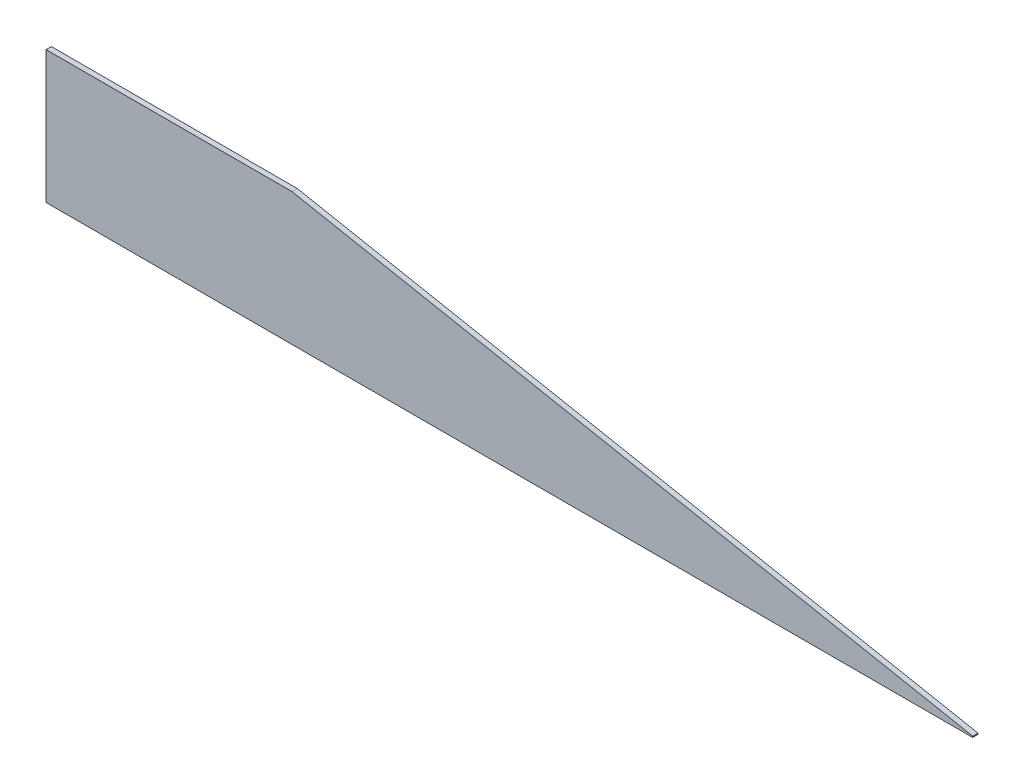
ISO-10303-21;
HEADER;
FILE_DESCRIPTION(('STEP AP214'),'2;1');
FILE_NAME('part.step','',(''),(''),'','','');
FILE_SCHEMA(('AUTOMOTIVE_DESIGN { 1 0 10303 214 1 1 1 1 }'));
ENDSEC;
DATA;
#1=APPLICATION_CONTEXT('core data for automotive mechanical design processes');
#2=APPLICATION_PROTOCOL_DEFINITION('international standard','automotive_design',2000,#1);
#3=PRODUCT_CONTEXT('',#1,'mechanical');
#4=PRODUCT('Part','Part','',(#3));
#5=PRODUCT_RELATED_PRODUCT_CATEGORY('part','',(#4));
#6=PRODUCT_DEFINITION_FORMATION('','',#4);
#7=PRODUCT_DEFINITION_CONTEXT('part definition',#1,'design');
#8=PRODUCT_DEFINITION('design','',#6,#7);
#9=PRODUCT_DEFINITION_SHAPE('','',#8);
#10=(LENGTH_UNIT() NAMED_UNIT(*) SI_UNIT(.MILLI.,.METRE.));
#11=(NAMED_UNIT(*) PLANE_ANGLE_UNIT() SI_UNIT($,.RADIAN.));
#12=(NAMED_UNIT(*) SI_UNIT($,.STERADIAN.) SOLID_ANGLE_UNIT());
#13=UNCERTAINTY_MEASURE_WITH_UNIT(LENGTH_MEASURE(1.E-05),#10,'distance_accuracy_value','');
#14=(GEOMETRIC_REPRESENTATION_CONTEXT(3) GLOBAL_UNCERTAINTY_ASSIGNED_CONTEXT((#13)) GLOBAL_UNIT_ASSIGNED_CONTEXT((#10,
#11,#12)) REPRESENTATION_CONTEXT('',''));
#15=CARTESIAN_POINT('',(0.,0.,0.));
#16=DIRECTION('',(0.,0.,1.));
#17=DIRECTION('',(1.,0.,0.));
#18=AXIS2_PLACEMENT_3D('',#15,#16,#17);
#19=CARTESIAN_POINT('',(778.,69.99,-0.01));
#20=DIRECTION('',(1.,0.,0.));
#21=DIRECTION('',(0.,1.,0.));
#22=AXIS2_PLACEMENT_3D('',#19,#20,#21);
#23=PLANE('',#22);
#24=DIRECTION('',(0.,-1.,0.));
#25=VECTOR('',#24,1.);
#26=CARTESIAN_POINT('',(778.,70.6445854996187,6.));
#27=LINE('',#26,#25);
#28=CARTESIAN_POINT('',(778.,71.2891709992374,6.));
#29=VERTEX_POINT('',#28);
#30=CARTESIAN_POINT('',(778.,70.,6.));
#31=VERTEX_POINT('',#30);
#32=EDGE_CURVE('E89',#29,#31,#27,.T.);
#33=ORIENTED_EDGE('',*,*,#32,.T.);
#34=DIRECTION('',(0.,0.,1.));
#35=VECTOR('',#34,1.);
#36=CARTESIAN_POINT('',(778.,70.,3.));
#37=LINE('',#36,#35);
#38=CARTESIAN_POINT('',(778.,70.,0.));
#39=VERTEX_POINT('',#38);
#40=EDGE_CURVE('E94',#39,#31,#37,.T.);
#41=ORIENTED_EDGE('',*,*,#40,.F.);
#42=DIRECTION('',(0.,-1.,0.));
#43=VECTOR('',#42,1.);
#44=CARTESIAN_POINT('',(778.,145.,0.));
#45=LINE('',#44,#43);
#46=CARTESIAN_POINT('',(778.,71.2891709992374,0.));
#47=VERTEX_POINT('',#46);
#48=EDGE_CURVE('E72',#47,#39,#45,.T.);
#49=ORIENTED_EDGE('',*,*,#48,.F.);
#50=DIRECTION('',(0.,0.,-1.));
#51=VECTOR('',#50,1.);
#52=CARTESIAN_POINT('',(778.,71.2891709992374,3.));
#53=LINE('',#52,#51);
#54=EDGE_CURVE('E69',#29,#47,#53,.T.);
#55=ORIENTED_EDGE('',*,*,#54,.F.);
#56=EDGE_LOOP('',(#33,#41,#49,#55));
#57=FACE_BOUND('',#56,.T.);
#58=ADVANCED_FACE('F17',(#57),#23,.T.);
#59=CARTESIAN_POINT('',(778.009819163138,71.2872778443907,-0.01));
#60=DIRECTION('',(0.189315484661945,0.981916313779954,0.));
#61=DIRECTION('',(-0.981916313779954,0.189315484661945,0.));
#62=AXIS2_PLACEMENT_3D('',#59,#60,#61);
#63=PLANE('',#62);
#64=DIRECTION('',(-0.981916313779954,0.189315484661945,0.));
#65=VECTOR('',#64,1.);
#66=CARTESIAN_POINT('',(778.,71.2891709992374,6.));
#67=LINE('',#66,#65);
#68=CARTESIAN_POINT('',(6.68650024937822,220.,6.));
#69=VERTEX_POINT('',#68);
#70=EDGE_CURVE('E79',#29,#69,#67,.T.);
#71=ORIENTED_EDGE('',*,*,#70,.F.);
#72=ORIENTED_EDGE('',*,*,#54,.T.);
#73=DIRECTION('',(0.981916313779954,-0.189315484661945,0.));
#74=VECTOR('',#73,1.);
#75=CARTESIAN_POINT('',(6.68650024937822,220.,0.));
#76=LINE('',#75,#74);
#77=CARTESIAN_POINT('',(6.68650024937828,220.,0.));
#78=VERTEX_POINT('',#77);
#79=EDGE_CURVE('E21',#78,#47,#76,.T.);
#80=ORIENTED_EDGE('',*,*,#79,.F.);
#81=DIRECTION('',(0.,0.,-1.));
#82=VECTOR('',#81,1.);
#83=CARTESIAN_POINT('',(6.68650024937833,220.,3.));
#84=LINE('',#83,#82);
#85=EDGE_CURVE('E67',#69,#78,#84,.T.);
#86=ORIENTED_EDGE('',*,*,#85,.F.);
#87=EDGE_LOOP('',(#71,#72,#80,#86));
#88=FACE_BOUND('',#87,.T.);
#89=ADVANCED_FACE('F65',(#88),#63,.T.);
#90=CARTESIAN_POINT('',(778.01,69.99,0.));
#91=DIRECTION('',(0.,0.,-1.));
#92=DIRECTION('',(-1.,0.,0.));
#93=AXIS2_PLACEMENT_3D('',#90,#91,#92);
#94=PLANE('',#93);
#95=DIRECTION('',(1.,0.,0.));
#96=VECTOR('',#95,1.);
#97=CARTESIAN_POINT('',(253.,70.,0.));
#98=LINE('',#97,#96);
#99=CARTESIAN_POINT('',(-272.,70.,0.));
#100=VERTEX_POINT('',#99);
#101=EDGE_CURVE('E91',#100,#39,#98,.T.);
#102=ORIENTED_EDGE('',*,*,#101,.F.);
#103=DIRECTION('',(0.,-1.,0.));
#104=VECTOR('',#103,1.);
#105=CARTESIAN_POINT('',(-272.,145.,0.));
#106=LINE('',#105,#104);
#107=CARTESIAN_POINT('',(-272.,220.,0.));
#108=VERTEX_POINT('',#107);
#109=EDGE_CURVE('E77',#108,#100,#106,.T.);
#110=ORIENTED_EDGE('',*,*,#109,.F.);
#111=DIRECTION('',(-1.,0.,0.));
#112=VECTOR('',#111,1.);
#113=CARTESIAN_POINT('',(-132.656749875311,220.,0.));
#114=LINE('',#113,#112);
#115=EDGE_CURVE('E74',#78,#108,#114,.T.);
#116=ORIENTED_EDGE('',*,*,#115,.F.);
#117=ORIENTED_EDGE('',*,*,#79,.T.);
#118=ORIENTED_EDGE('',*,*,#48,.T.);
#119=EDGE_LOOP('',(#102,#110,#116,#117,#118));
#120=FACE_BOUND('',#119,.T.);
#121=ADVANCED_FACE('F75',(#120),#94,.T.);
#122=CARTESIAN_POINT('',(-272.01,70.,-0.01));
#123=DIRECTION('',(0.,-1.,0.));
#124=DIRECTION('',(1.,0.,0.));
#125=AXIS2_PLACEMENT_3D('',#122,#123,#124);
#126=PLANE('',#125);
#127=DIRECTION('',(1.,0.,0.));
#128=VECTOR('',#127,1.);
#129=CARTESIAN_POINT('',(253.,70.,6.));
#130=LINE('',#129,#128);
#131=CARTESIAN_POINT('',(-272.,70.,6.));
#132=VERTEX_POINT('',#131);
#133=EDGE_CURVE('E92',#132,#31,#130,.T.);
#134=ORIENTED_EDGE('',*,*,#133,.F.);
#135=DIRECTION('',(0.,0.,1.));
#136=VECTOR('',#135,1.);
#137=CARTESIAN_POINT('',(-272.,70.,3.));
#138=LINE('',#137,#136);
#139=EDGE_CURVE('E83',#100,#132,#138,.T.);
#140=ORIENTED_EDGE('',*,*,#139,.F.);
#141=ORIENTED_EDGE('',*,*,#101,.T.);
#142=ORIENTED_EDGE('',*,*,#40,.T.);
#143=EDGE_LOOP('',(#134,#140,#141,#142));
#144=FACE_BOUND('',#143,.T.);
#145=ADVANCED_FACE('F102',(#144),#126,.T.);
#146=CARTESIAN_POINT('',(-272.01,69.99,6.));
#147=DIRECTION('',(0.,0.,1.));
#148=DIRECTION('',(1.,0.,0.));
#149=AXIS2_PLACEMENT_3D('',#146,#147,#148);
#150=PLANE('',#149);
#151=ORIENTED_EDGE('',*,*,#32,.F.);
#152=ORIENTED_EDGE('',*,*,#70,.T.);
#153=DIRECTION('',(1.,0.,0.));
#154=VECTOR('',#153,1.);
#155=CARTESIAN_POINT('',(-132.656749875311,220.,6.));
#156=LINE('',#155,#154);
#157=CARTESIAN_POINT('',(-272.,220.,6.));
#158=VERTEX_POINT('',#157);
#159=EDGE_CURVE('E36',#158,#69,#156,.T.);
#160=ORIENTED_EDGE('',*,*,#159,.F.);
#161=DIRECTION('',(0.,1.,0.));
#162=VECTOR('',#161,1.);
#163=CARTESIAN_POINT('',(-272.,145.,6.));
#164=LINE('',#163,#162);
#165=EDGE_CURVE('E27',#132,#158,#164,.T.);
#166=ORIENTED_EDGE('',*,*,#165,.F.);
#167=ORIENTED_EDGE('',*,*,#133,.T.);
#168=EDGE_LOOP('',(#151,#152,#160,#166,#167));
#169=FACE_BOUND('',#168,.T.);
#170=ADVANCED_FACE('F106',(#169),#150,.T.);
#171=CARTESIAN_POINT('',(6.69650024937834,220.,-0.01));
#172=DIRECTION('',(0.,1.,0.));
#173=DIRECTION('',(-1.,0.,0.));
#174=AXIS2_PLACEMENT_3D('',#171,#172,#173);
#175=PLANE('',#174);
#176=ORIENTED_EDGE('',*,*,#159,.T.);
#177=ORIENTED_EDGE('',*,*,#85,.T.);
#178=ORIENTED_EDGE('',*,*,#115,.T.);
#179=DIRECTION('',(0.,0.,-1.));
#180=VECTOR('',#179,1.);
#181=CARTESIAN_POINT('',(-272.,220.,3.));
#182=LINE('',#181,#180);
#183=EDGE_CURVE('E11',#158,#108,#182,.T.);
#184=ORIENTED_EDGE('',*,*,#183,.F.);
#185=EDGE_LOOP('',(#176,#177,#178,#184));
#186=FACE_BOUND('',#185,.T.);
#187=ADVANCED_FACE('F81',(#186),#175,.T.);
#188=CARTESIAN_POINT('',(-272.,220.01,-0.01));
#189=DIRECTION('',(-1.,0.,0.));
#190=DIRECTION('',(0.,-1.,0.));
#191=AXIS2_PLACEMENT_3D('',#188,#189,#190);
#192=PLANE('',#191);
#193=ORIENTED_EDGE('',*,*,#165,.T.);
#194=ORIENTED_EDGE('',*,*,#183,.T.);
#195=ORIENTED_EDGE('',*,*,#109,.T.);
#196=ORIENTED_EDGE('',*,*,#139,.T.);
#197=EDGE_LOOP('',(#193,#194,#195,#196));
#198=FACE_BOUND('',#197,.T.);
#199=ADVANCED_FACE('F19',(#198),#192,.T.);
#200=CLOSED_SHELL('',(#58,#89,#121,#145,#170,#187,#199));
#201=MANIFOLD_SOLID_BREP('B1',#200);
#202=ADVANCED_BREP_SHAPE_REPRESENTATION('',(#18,#201),#14);
#203=SHAPE_DEFINITION_REPRESENTATION(#9,#202);
ENDSEC;
END-ISO-10303-21;
